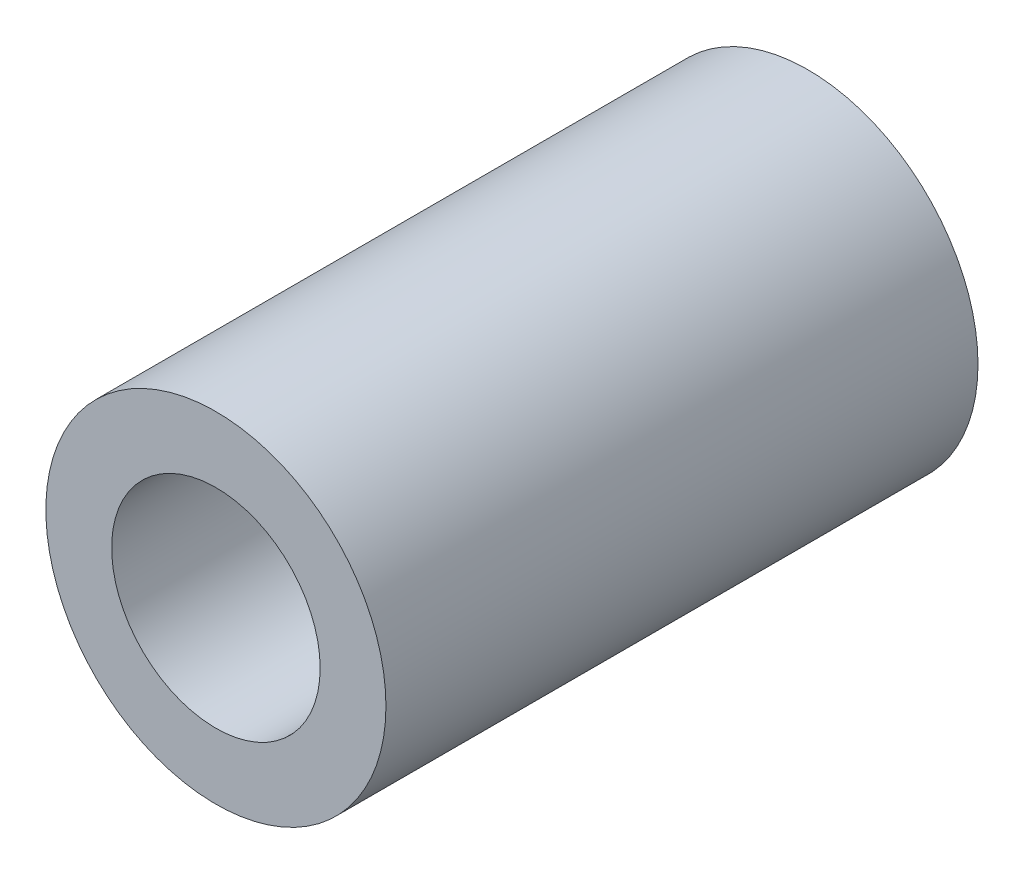
ISO-10303-21;
HEADER;
FILE_DESCRIPTION(('STEP AP214'),'2;1');
FILE_NAME('part.step','',(''),(''),'','','');
FILE_SCHEMA(('AUTOMOTIVE_DESIGN { 1 0 10303 214 1 1 1 1 }'));
ENDSEC;
DATA;
#1=APPLICATION_CONTEXT('core data for automotive mechanical design processes');
#2=APPLICATION_PROTOCOL_DEFINITION('international standard','automotive_design',2000,#1);
#3=PRODUCT_CONTEXT('',#1,'mechanical');
#4=PRODUCT('Part','Part','',(#3));
#5=PRODUCT_RELATED_PRODUCT_CATEGORY('part','',(#4));
#6=PRODUCT_DEFINITION_FORMATION('','',#4);
#7=PRODUCT_DEFINITION_CONTEXT('part definition',#1,'design');
#8=PRODUCT_DEFINITION('design','',#6,#7);
#9=PRODUCT_DEFINITION_SHAPE('','',#8);
#10=(LENGTH_UNIT() NAMED_UNIT(*) SI_UNIT(.MILLI.,.METRE.));
#11=(NAMED_UNIT(*) PLANE_ANGLE_UNIT() SI_UNIT($,.RADIAN.));
#12=(NAMED_UNIT(*) SI_UNIT($,.STERADIAN.) SOLID_ANGLE_UNIT());
#13=UNCERTAINTY_MEASURE_WITH_UNIT(LENGTH_MEASURE(1.E-05),#10,'distance_accuracy_value','');
#14=(GEOMETRIC_REPRESENTATION_CONTEXT(3) GLOBAL_UNCERTAINTY_ASSIGNED_CONTEXT((#13)) GLOBAL_UNIT_ASSIGNED_CONTEXT((#10,
#11,#12)) REPRESENTATION_CONTEXT('',''));
#15=CARTESIAN_POINT('',(0.,0.,0.));
#16=DIRECTION('',(0.,0.,1.));
#17=DIRECTION('',(1.,0.,0.));
#18=AXIS2_PLACEMENT_3D('',#15,#16,#17);
#19=CARTESIAN_POINT('',(0.,0.,9.));
#20=DIRECTION('',(0.,0.,1.));
#21=DIRECTION('',(1.,0.,0.));
#22=AXIS2_PLACEMENT_3D('',#19,#20,#21);
#23=PLANE('',#22);
#24=CARTESIAN_POINT('',(0.,0.,9.));
#25=DIRECTION('',(0.,0.,1.));
#26=DIRECTION('',(1.,0.,0.));
#27=AXIS2_PLACEMENT_3D('',#24,#25,#26);
#28=CIRCLE('',#27,2.585);
#29=CARTESIAN_POINT('',(2.585,0.,9.));
#30=VERTEX_POINT('',#29);
#31=EDGE_CURVE('E10',#30,#30,#28,.T.);
#32=ORIENTED_EDGE('',*,*,#31,.T.);
#33=EDGE_LOOP('',(#32));
#34=FACE_BOUND('',#33,.T.);
#35=CARTESIAN_POINT('',(0.,0.,9.));
#36=DIRECTION('',(0.,0.,1.));
#37=DIRECTION('',(1.,0.,0.));
#38=AXIS2_PLACEMENT_3D('',#35,#36,#37);
#39=CIRCLE('',#38,1.585);
#40=CARTESIAN_POINT('',(1.585,0.,9.));
#41=VERTEX_POINT('',#40);
#42=EDGE_CURVE('E50',#41,#41,#39,.T.);
#43=ORIENTED_EDGE('',*,*,#42,.F.);
#44=EDGE_LOOP('',(#43));
#45=FACE_BOUND('',#44,.T.);
#46=ADVANCED_FACE('F37',(#34,#45),#23,.T.);
#47=CARTESIAN_POINT('',(0.,0.,0.));
#48=DIRECTION('',(0.,0.,1.));
#49=DIRECTION('',(1.,0.,0.));
#50=AXIS2_PLACEMENT_3D('',#47,#48,#49);
#51=PLANE('',#50);
#52=CARTESIAN_POINT('',(0.,0.,0.));
#53=DIRECTION('',(0.,0.,1.));
#54=DIRECTION('',(1.,0.,0.));
#55=AXIS2_PLACEMENT_3D('',#52,#53,#54);
#56=CIRCLE('',#55,2.585);
#57=CARTESIAN_POINT('',(2.585,0.,0.));
#58=VERTEX_POINT('',#57);
#59=EDGE_CURVE('E41',#58,#58,#56,.T.);
#60=ORIENTED_EDGE('',*,*,#59,.F.);
#61=EDGE_LOOP('',(#60));
#62=FACE_BOUND('',#61,.T.);
#63=CARTESIAN_POINT('',(0.,0.,0.));
#64=DIRECTION('',(0.,0.,1.));
#65=DIRECTION('',(1.,0.,0.));
#66=AXIS2_PLACEMENT_3D('',#63,#64,#65);
#67=CIRCLE('',#66,1.585);
#68=CARTESIAN_POINT('',(1.585,0.,0.));
#69=VERTEX_POINT('',#68);
#70=EDGE_CURVE('E52',#69,#69,#67,.T.);
#71=ORIENTED_EDGE('',*,*,#70,.T.);
#72=EDGE_LOOP('',(#71));
#73=FACE_BOUND('',#72,.T.);
#74=ADVANCED_FACE('F64',(#62,#73),#51,.F.);
#75=CARTESIAN_POINT('',(0.,0.,9.));
#76=DIRECTION('',(0.,0.,-1.));
#77=DIRECTION('',(-1.,0.,0.));
#78=AXIS2_PLACEMENT_3D('',#75,#76,#77);
#79=CYLINDRICAL_SURFACE('',#78,2.585);
#80=ORIENTED_EDGE('',*,*,#31,.F.);
#81=EDGE_LOOP('',(#80));
#82=FACE_BOUND('',#81,.T.);
#83=ORIENTED_EDGE('',*,*,#59,.T.);
#84=EDGE_LOOP('',(#83));
#85=FACE_BOUND('',#84,.T.);
#86=ADVANCED_FACE('F39',(#82,#85),#79,.T.);
#87=CARTESIAN_POINT('',(0.,0.,9.));
#88=DIRECTION('',(0.,0.,-1.));
#89=DIRECTION('',(-1.,0.,0.));
#90=AXIS2_PLACEMENT_3D('',#87,#88,#89);
#91=CYLINDRICAL_SURFACE('',#90,1.585);
#92=ORIENTED_EDGE('',*,*,#42,.T.);
#93=EDGE_LOOP('',(#92));
#94=FACE_BOUND('',#93,.T.);
#95=ORIENTED_EDGE('',*,*,#70,.F.);
#96=EDGE_LOOP('',(#95));
#97=FACE_BOUND('',#96,.T.);
#98=ADVANCED_FACE('F60',(#94,#97),#91,.F.);
#99=CLOSED_SHELL('',(#46,#74,#86,#98));
#100=MANIFOLD_SOLID_BREP('B2',#99);
#101=ADVANCED_BREP_SHAPE_REPRESENTATION('',(#18,#100),#14);
#102=SHAPE_DEFINITION_REPRESENTATION(#9,#101);
ENDSEC;
END-ISO-10303-21;
